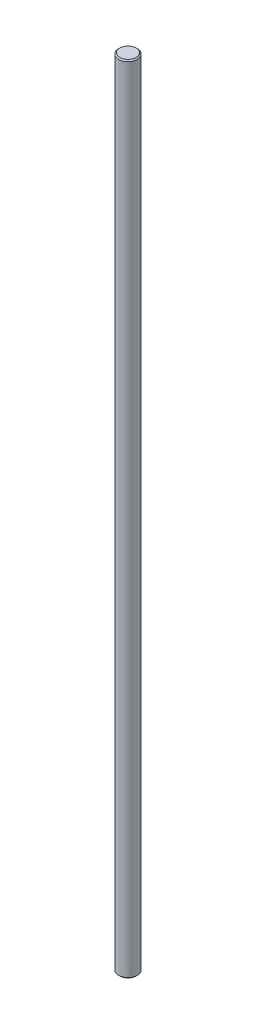
ISO-10303-21;
HEADER;
FILE_DESCRIPTION(('STEP AP214'),'2;1');
FILE_NAME('part.step','',(''),(''),'','','');
FILE_SCHEMA(('AUTOMOTIVE_DESIGN { 1 0 10303 214 1 1 1 1 }'));
ENDSEC;
DATA;
#1=APPLICATION_CONTEXT('core data for automotive mechanical design processes');
#2=APPLICATION_PROTOCOL_DEFINITION('international standard','automotive_design',2000,#1);
#3=PRODUCT_CONTEXT('',#1,'mechanical');
#4=PRODUCT('Part','Part','',(#3));
#5=PRODUCT_RELATED_PRODUCT_CATEGORY('part','',(#4));
#6=PRODUCT_DEFINITION_FORMATION('','',#4);
#7=PRODUCT_DEFINITION_CONTEXT('part definition',#1,'design');
#8=PRODUCT_DEFINITION('design','',#6,#7);
#9=PRODUCT_DEFINITION_SHAPE('','',#8);
#10=(LENGTH_UNIT() NAMED_UNIT(*) SI_UNIT(.MILLI.,.METRE.));
#11=(NAMED_UNIT(*) PLANE_ANGLE_UNIT() SI_UNIT($,.RADIAN.));
#12=(NAMED_UNIT(*) SI_UNIT($,.STERADIAN.) SOLID_ANGLE_UNIT());
#13=UNCERTAINTY_MEASURE_WITH_UNIT(LENGTH_MEASURE(1.E-05),#10,'distance_accuracy_value','');
#14=(GEOMETRIC_REPRESENTATION_CONTEXT(3) GLOBAL_UNCERTAINTY_ASSIGNED_CONTEXT((#13)) GLOBAL_UNIT_ASSIGNED_CONTEXT((#10,
#11,#12)) REPRESENTATION_CONTEXT('',''));
#15=CARTESIAN_POINT('',(0.,0.,0.));
#16=DIRECTION('',(0.,0.,1.));
#17=DIRECTION('',(1.,0.,0.));
#18=AXIS2_PLACEMENT_3D('',#15,#16,#17);
#19=CARTESIAN_POINT('',(0.,340.,0.));
#20=DIRECTION('',(0.,-1.,0.));
#21=DIRECTION('',(0.,0.,-1.));
#22=AXIS2_PLACEMENT_3D('',#19,#20,#21);
#23=CYLINDRICAL_SURFACE('',#22,4.);
#24=CARTESIAN_POINT('',(0.,339.5,0.));
#25=DIRECTION('',(0.,1.,0.));
#26=DIRECTION('',(0.,0.,1.));
#27=AXIS2_PLACEMENT_3D('',#24,#25,#26);
#28=CIRCLE('',#27,4.);
#29=CARTESIAN_POINT('',(0.,339.5,4.));
#30=VERTEX_POINT('',#29);
#31=EDGE_CURVE('E37',#30,#30,#28,.F.);
#32=ORIENTED_EDGE('',*,*,#31,.T.);
#33=EDGE_LOOP('',(#32));
#34=FACE_BOUND('',#33,.T.);
#35=CARTESIAN_POINT('',(0.,0.500000000000056,0.));
#36=DIRECTION('',(0.,1.,0.));
#37=DIRECTION('',(0.,0.,1.));
#38=AXIS2_PLACEMENT_3D('',#35,#36,#37);
#39=CIRCLE('',#38,4.);
#40=CARTESIAN_POINT('',(0.,0.500000000000056,4.));
#41=VERTEX_POINT('',#40);
#42=EDGE_CURVE('E41',#41,#41,#39,.T.);
#43=ORIENTED_EDGE('',*,*,#42,.T.);
#44=EDGE_LOOP('',(#43));
#45=FACE_BOUND('',#44,.T.);
#46=ADVANCED_FACE('F30',(#34,#45),#23,.T.);
#47=CARTESIAN_POINT('',(0.,340.,0.));
#48=DIRECTION('',(0.,1.,0.));
#49=DIRECTION('',(0.,0.,1.));
#50=AXIS2_PLACEMENT_3D('',#47,#48,#49);
#51=PLANE('',#50);
#52=CARTESIAN_POINT('',(0.,340.,0.));
#53=DIRECTION('',(0.,1.,0.));
#54=DIRECTION('',(0.,0.,1.));
#55=AXIS2_PLACEMENT_3D('',#52,#53,#54);
#56=CIRCLE('',#55,3.49999999999998);
#57=CARTESIAN_POINT('',(0.,340.,3.49999999999998));
#58=VERTEX_POINT('',#57);
#59=EDGE_CURVE('E45',#58,#58,#56,.T.);
#60=ORIENTED_EDGE('',*,*,#59,.T.);
#61=EDGE_LOOP('',(#60));
#62=FACE_BOUND('',#61,.T.);
#63=ADVANCED_FACE('F51',(#62),#51,.T.);
#64=CARTESIAN_POINT('',(0.,0.,0.));
#65=DIRECTION('',(0.,1.,0.));
#66=DIRECTION('',(0.,0.,1.));
#67=AXIS2_PLACEMENT_3D('',#64,#65,#66);
#68=PLANE('',#67);
#69=CARTESIAN_POINT('',(0.,0.,0.));
#70=DIRECTION('',(0.,1.,0.));
#71=DIRECTION('',(0.,0.,1.));
#72=AXIS2_PLACEMENT_3D('',#69,#70,#71);
#73=CIRCLE('',#72,3.49999999999995);
#74=CARTESIAN_POINT('',(0.,0.,3.49999999999995));
#75=VERTEX_POINT('',#74);
#76=EDGE_CURVE('E10',#75,#75,#73,.F.);
#77=ORIENTED_EDGE('',*,*,#76,.T.);
#78=EDGE_LOOP('',(#77));
#79=FACE_BOUND('',#78,.T.);
#80=ADVANCED_FACE('F55',(#79),#68,.F.);
#81=CARTESIAN_POINT('',(0.,340.,0.));
#82=DIRECTION('',(0.,-1.,0.));
#83=DIRECTION('',(0.,0.,-1.));
#84=AXIS2_PLACEMENT_3D('',#81,#82,#83);
#85=CONICAL_SURFACE('',#84,3.49999999999998,0.785398163397417);
#86=ORIENTED_EDGE('',*,*,#31,.F.);
#87=EDGE_LOOP('',(#86));
#88=FACE_BOUND('',#87,.T.);
#89=ORIENTED_EDGE('',*,*,#59,.F.);
#90=EDGE_LOOP('',(#89));
#91=FACE_BOUND('',#90,.T.);
#92=ADVANCED_FACE('F53',(#88,#91),#85,.T.);
#93=CARTESIAN_POINT('',(0.,0.500000000000056,0.));
#94=DIRECTION('',(0.,1.,0.));
#95=DIRECTION('',(0.,0.,1.));
#96=AXIS2_PLACEMENT_3D('',#93,#94,#95);
#97=CONICAL_SURFACE('',#96,4.,0.785398163397445);
#98=ORIENTED_EDGE('',*,*,#76,.F.);
#99=EDGE_LOOP('',(#98));
#100=FACE_BOUND('',#99,.T.);
#101=ORIENTED_EDGE('',*,*,#42,.F.);
#102=EDGE_LOOP('',(#101));
#103=FACE_BOUND('',#102,.T.);
#104=ADVANCED_FACE('F32',(#100,#103),#97,.T.);
#105=CLOSED_SHELL('',(#46,#63,#80,#92,#104));
#106=MANIFOLD_SOLID_BREP('B2',#105);
#107=ADVANCED_BREP_SHAPE_REPRESENTATION('',(#18,#106),#14);
#108=SHAPE_DEFINITION_REPRESENTATION(#9,#107);
ENDSEC;
END-ISO-10303-21;
